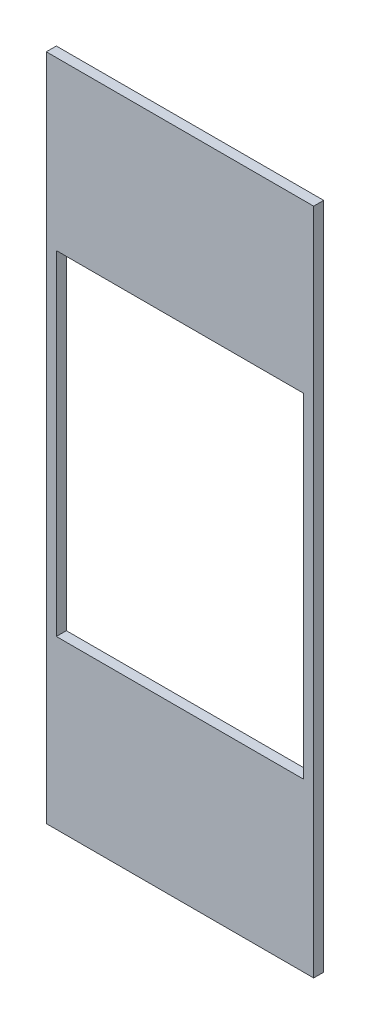
ISO-10303-21;
HEADER;
FILE_DESCRIPTION(('STEP AP214'),'2;1');
FILE_NAME('part.step','',(''),(''),'','','');
FILE_SCHEMA(('AUTOMOTIVE_DESIGN { 1 0 10303 214 1 1 1 1 }'));
ENDSEC;
DATA;
#1=APPLICATION_CONTEXT('core data for automotive mechanical design processes');
#2=APPLICATION_PROTOCOL_DEFINITION('international standard','automotive_design',2000,#1);
#3=PRODUCT_CONTEXT('',#1,'mechanical');
#4=PRODUCT('Part','Part','',(#3));
#5=PRODUCT_RELATED_PRODUCT_CATEGORY('part','',(#4));
#6=PRODUCT_DEFINITION_FORMATION('','',#4);
#7=PRODUCT_DEFINITION_CONTEXT('part definition',#1,'design');
#8=PRODUCT_DEFINITION('design','',#6,#7);
#9=PRODUCT_DEFINITION_SHAPE('','',#8);
#10=(LENGTH_UNIT() NAMED_UNIT(*) SI_UNIT(.MILLI.,.METRE.));
#11=(NAMED_UNIT(*) PLANE_ANGLE_UNIT() SI_UNIT($,.RADIAN.));
#12=(NAMED_UNIT(*) SI_UNIT($,.STERADIAN.) SOLID_ANGLE_UNIT());
#13=UNCERTAINTY_MEASURE_WITH_UNIT(LENGTH_MEASURE(1.E-05),#10,'distance_accuracy_value','');
#14=(GEOMETRIC_REPRESENTATION_CONTEXT(3) GLOBAL_UNCERTAINTY_ASSIGNED_CONTEXT((#13)) GLOBAL_UNIT_ASSIGNED_CONTEXT((#10,
#11,#12)) REPRESENTATION_CONTEXT('',''));
#15=CARTESIAN_POINT('',(0.,0.,0.));
#16=DIRECTION('',(0.,0.,1.));
#17=DIRECTION('',(1.,0.,0.));
#18=AXIS2_PLACEMENT_3D('',#15,#16,#17);
#19=CARTESIAN_POINT('',(-20.,50.,1.5));
#20=DIRECTION('',(1.,0.,0.));
#21=DIRECTION('',(0.,1.,0.));
#22=AXIS2_PLACEMENT_3D('',#19,#20,#21);
#23=PLANE('',#22);
#24=DIRECTION('',(0.,-1.,0.));
#25=VECTOR('',#24,1.);
#26=CARTESIAN_POINT('',(-20.,50.,0.));
#27=LINE('',#26,#25);
#28=CARTESIAN_POINT('',(-20.,50.,0.));
#29=VERTEX_POINT('',#28);
#30=CARTESIAN_POINT('',(-20.,-50.,0.));
#31=VERTEX_POINT('',#30);
#32=EDGE_CURVE('E139',#29,#31,#27,.T.);
#33=ORIENTED_EDGE('',*,*,#32,.T.);
#34=DIRECTION('',(0.,0.,-1.));
#35=VECTOR('',#34,1.);
#36=CARTESIAN_POINT('',(-20.,-50.,1.5));
#37=LINE('',#36,#35);
#38=CARTESIAN_POINT('',(-20.,-50.,1.5));
#39=VERTEX_POINT('',#38);
#40=EDGE_CURVE('E11',#39,#31,#37,.T.);
#41=ORIENTED_EDGE('',*,*,#40,.F.);
#42=DIRECTION('',(0.,-1.,0.));
#43=VECTOR('',#42,1.);
#44=CARTESIAN_POINT('',(-20.,50.,1.5));
#45=LINE('',#44,#43);
#46=CARTESIAN_POINT('',(-20.,50.,1.5));
#47=VERTEX_POINT('',#46);
#48=EDGE_CURVE('E143',#47,#39,#45,.T.);
#49=ORIENTED_EDGE('',*,*,#48,.F.);
#50=DIRECTION('',(0.,0.,-1.));
#51=VECTOR('',#50,1.);
#52=CARTESIAN_POINT('',(-20.,50.,1.5));
#53=LINE('',#52,#51);
#54=EDGE_CURVE('E153',#47,#29,#53,.T.);
#55=ORIENTED_EDGE('',*,*,#54,.T.);
#56=EDGE_LOOP('',(#33,#41,#49,#55));
#57=FACE_BOUND('',#56,.T.);
#58=ADVANCED_FACE('F42',(#57),#23,.F.);
#59=CARTESIAN_POINT('',(-20.,-50.,1.5));
#60=DIRECTION('',(0.,1.,0.));
#61=DIRECTION('',(0.,0.,1.));
#62=AXIS2_PLACEMENT_3D('',#59,#60,#61);
#63=PLANE('',#62);
#64=DIRECTION('',(1.,0.,0.));
#65=VECTOR('',#64,1.);
#66=CARTESIAN_POINT('',(-20.,-50.,0.));
#67=LINE('',#66,#65);
#68=CARTESIAN_POINT('',(20.,-50.,0.));
#69=VERTEX_POINT('',#68);
#70=EDGE_CURVE('E156',#31,#69,#67,.T.);
#71=ORIENTED_EDGE('',*,*,#70,.T.);
#72=DIRECTION('',(0.,0.,-1.));
#73=VECTOR('',#72,1.);
#74=CARTESIAN_POINT('',(20.,-50.,1.5));
#75=LINE('',#74,#73);
#76=CARTESIAN_POINT('',(20.,-50.,1.5));
#77=VERTEX_POINT('',#76);
#78=EDGE_CURVE('E49',#77,#69,#75,.T.);
#79=ORIENTED_EDGE('',*,*,#78,.F.);
#80=DIRECTION('',(1.,0.,0.));
#81=VECTOR('',#80,1.);
#82=CARTESIAN_POINT('',(-20.,-50.,1.5));
#83=LINE('',#82,#81);
#84=EDGE_CURVE('E146',#39,#77,#83,.T.);
#85=ORIENTED_EDGE('',*,*,#84,.F.);
#86=ORIENTED_EDGE('',*,*,#40,.T.);
#87=EDGE_LOOP('',(#71,#79,#85,#86));
#88=FACE_BOUND('',#87,.T.);
#89=ADVANCED_FACE('F184',(#88),#63,.F.);
#90=CARTESIAN_POINT('',(20.,-50.,1.5));
#91=DIRECTION('',(-1.,0.,0.));
#92=DIRECTION('',(0.,0.,1.));
#93=AXIS2_PLACEMENT_3D('',#90,#91,#92);
#94=PLANE('',#93);
#95=DIRECTION('',(0.,1.,0.));
#96=VECTOR('',#95,1.);
#97=CARTESIAN_POINT('',(20.,-50.,0.));
#98=LINE('',#97,#96);
#99=CARTESIAN_POINT('',(20.,50.,0.));
#100=VERTEX_POINT('',#99);
#101=EDGE_CURVE('E158',#69,#100,#98,.T.);
#102=ORIENTED_EDGE('',*,*,#101,.T.);
#103=DIRECTION('',(0.,0.,-1.));
#104=VECTOR('',#103,1.);
#105=CARTESIAN_POINT('',(20.,50.,1.5));
#106=LINE('',#105,#104);
#107=CARTESIAN_POINT('',(20.,50.,1.5));
#108=VERTEX_POINT('',#107);
#109=EDGE_CURVE('E163',#108,#100,#106,.T.);
#110=ORIENTED_EDGE('',*,*,#109,.F.);
#111=DIRECTION('',(0.,1.,0.));
#112=VECTOR('',#111,1.);
#113=CARTESIAN_POINT('',(20.,-50.,1.5));
#114=LINE('',#113,#112);
#115=EDGE_CURVE('E149',#77,#108,#114,.T.);
#116=ORIENTED_EDGE('',*,*,#115,.F.);
#117=ORIENTED_EDGE('',*,*,#78,.T.);
#118=EDGE_LOOP('',(#102,#110,#116,#117));
#119=FACE_BOUND('',#118,.T.);
#120=ADVANCED_FACE('F170',(#119),#94,.F.);
#121=CARTESIAN_POINT('',(-20.,50.,1.5));
#122=DIRECTION('',(0.,-1.,0.));
#123=DIRECTION('',(0.,0.,-1.));
#124=AXIS2_PLACEMENT_3D('',#121,#122,#123);
#125=PLANE('',#124);
#126=DIRECTION('',(-1.,0.,0.));
#127=VECTOR('',#126,1.);
#128=CARTESIAN_POINT('',(-20.,50.,0.));
#129=LINE('',#128,#127);
#130=EDGE_CURVE('E147',#100,#29,#129,.T.);
#131=ORIENTED_EDGE('',*,*,#130,.T.);
#132=ORIENTED_EDGE('',*,*,#54,.F.);
#133=DIRECTION('',(-1.,0.,0.));
#134=VECTOR('',#133,1.);
#135=CARTESIAN_POINT('',(-20.,50.,1.5));
#136=LINE('',#135,#134);
#137=EDGE_CURVE('E151',#108,#47,#136,.T.);
#138=ORIENTED_EDGE('',*,*,#137,.F.);
#139=ORIENTED_EDGE('',*,*,#109,.T.);
#140=EDGE_LOOP('',(#131,#132,#138,#139));
#141=FACE_BOUND('',#140,.T.);
#142=ADVANCED_FACE('F177',(#141),#125,.F.);
#143=CARTESIAN_POINT('',(0.,0.,1.5));
#144=DIRECTION('',(0.,0.,1.));
#145=DIRECTION('',(1.,0.,0.));
#146=AXIS2_PLACEMENT_3D('',#143,#144,#145);
#147=PLANE('',#146);
#148=DIRECTION('',(1.,0.,0.));
#149=VECTOR('',#148,1.);
#150=CARTESIAN_POINT('',(-18.5,-25.,1.5));
#151=LINE('',#150,#149);
#152=CARTESIAN_POINT('',(-18.5,-25.,1.5));
#153=VERTEX_POINT('',#152);
#154=CARTESIAN_POINT('',(18.5,-25.,1.5));
#155=VERTEX_POINT('',#154);
#156=EDGE_CURVE('E56',#153,#155,#151,.T.);
#157=ORIENTED_EDGE('',*,*,#156,.F.);
#158=DIRECTION('',(0.,-1.,0.));
#159=VECTOR('',#158,1.);
#160=CARTESIAN_POINT('',(-18.5,25.,1.5));
#161=LINE('',#160,#159);
#162=CARTESIAN_POINT('',(-18.5,25.,1.5));
#163=VERTEX_POINT('',#162);
#164=EDGE_CURVE('E124',#163,#153,#161,.T.);
#165=ORIENTED_EDGE('',*,*,#164,.F.);
#166=DIRECTION('',(-1.,0.,0.));
#167=VECTOR('',#166,1.);
#168=CARTESIAN_POINT('',(-18.5,25.,1.5));
#169=LINE('',#168,#167);
#170=CARTESIAN_POINT('',(18.5,25.,1.5));
#171=VERTEX_POINT('',#170);
#172=EDGE_CURVE('E127',#171,#163,#169,.T.);
#173=ORIENTED_EDGE('',*,*,#172,.F.);
#174=DIRECTION('',(0.,1.,0.));
#175=VECTOR('',#174,1.);
#176=CARTESIAN_POINT('',(18.5,25.,1.5));
#177=LINE('',#176,#175);
#178=EDGE_CURVE('E133',#155,#171,#177,.T.);
#179=ORIENTED_EDGE('',*,*,#178,.F.);
#180=EDGE_LOOP('',(#157,#165,#173,#179));
#181=FACE_BOUND('',#180,.T.);
#182=ORIENTED_EDGE('',*,*,#48,.T.);
#183=ORIENTED_EDGE('',*,*,#84,.T.);
#184=ORIENTED_EDGE('',*,*,#115,.T.);
#185=ORIENTED_EDGE('',*,*,#137,.T.);
#186=EDGE_LOOP('',(#182,#183,#184,#185));
#187=FACE_BOUND('',#186,.T.);
#188=ADVANCED_FACE('F183',(#181,#187),#147,.T.);
#189=CARTESIAN_POINT('',(0.,0.,0.));
#190=DIRECTION('',(0.,0.,1.));
#191=DIRECTION('',(1.,0.,0.));
#192=AXIS2_PLACEMENT_3D('',#189,#190,#191);
#193=PLANE('',#192);
#194=DIRECTION('',(0.,-1.,0.));
#195=VECTOR('',#194,1.);
#196=CARTESIAN_POINT('',(-18.5,25.,0.));
#197=LINE('',#196,#195);
#198=CARTESIAN_POINT('',(-18.5,25.,0.));
#199=VERTEX_POINT('',#198);
#200=CARTESIAN_POINT('',(-18.5,-25.,0.));
#201=VERTEX_POINT('',#200);
#202=EDGE_CURVE('E114',#199,#201,#197,.T.);
#203=ORIENTED_EDGE('',*,*,#202,.T.);
#204=DIRECTION('',(1.,0.,0.));
#205=VECTOR('',#204,1.);
#206=CARTESIAN_POINT('',(-18.5,-25.,0.));
#207=LINE('',#206,#205);
#208=CARTESIAN_POINT('',(18.5,-25.,0.));
#209=VERTEX_POINT('',#208);
#210=EDGE_CURVE('E108',#201,#209,#207,.T.);
#211=ORIENTED_EDGE('',*,*,#210,.T.);
#212=DIRECTION('',(0.,1.,0.));
#213=VECTOR('',#212,1.);
#214=CARTESIAN_POINT('',(18.5,25.,0.));
#215=LINE('',#214,#213);
#216=CARTESIAN_POINT('',(18.5,25.,0.));
#217=VERTEX_POINT('',#216);
#218=EDGE_CURVE('E117',#209,#217,#215,.T.);
#219=ORIENTED_EDGE('',*,*,#218,.T.);
#220=DIRECTION('',(-1.,0.,0.));
#221=VECTOR('',#220,1.);
#222=CARTESIAN_POINT('',(-18.5,25.,0.));
#223=LINE('',#222,#221);
#224=EDGE_CURVE('E64',#217,#199,#223,.T.);
#225=ORIENTED_EDGE('',*,*,#224,.T.);
#226=EDGE_LOOP('',(#203,#211,#219,#225));
#227=FACE_BOUND('',#226,.T.);
#228=ORIENTED_EDGE('',*,*,#32,.F.);
#229=ORIENTED_EDGE('',*,*,#130,.F.);
#230=ORIENTED_EDGE('',*,*,#101,.F.);
#231=ORIENTED_EDGE('',*,*,#70,.F.);
#232=EDGE_LOOP('',(#228,#229,#230,#231));
#233=FACE_BOUND('',#232,.T.);
#234=ADVANCED_FACE('F121',(#227,#233),#193,.F.);
#235=CARTESIAN_POINT('',(-18.5,-25.,0.));
#236=DIRECTION('',(0.,-1.,0.));
#237=DIRECTION('',(0.,0.,-1.));
#238=AXIS2_PLACEMENT_3D('',#235,#236,#237);
#239=PLANE('',#238);
#240=ORIENTED_EDGE('',*,*,#156,.T.);
#241=DIRECTION('',(0.,0.,1.));
#242=VECTOR('',#241,1.);
#243=CARTESIAN_POINT('',(18.5,-25.,0.));
#244=LINE('',#243,#242);
#245=EDGE_CURVE('E104',#209,#155,#244,.T.);
#246=ORIENTED_EDGE('',*,*,#245,.F.);
#247=ORIENTED_EDGE('',*,*,#210,.F.);
#248=DIRECTION('',(0.,0.,1.));
#249=VECTOR('',#248,1.);
#250=CARTESIAN_POINT('',(-18.5,-25.,0.));
#251=LINE('',#250,#249);
#252=EDGE_CURVE('E137',#201,#153,#251,.T.);
#253=ORIENTED_EDGE('',*,*,#252,.T.);
#254=EDGE_LOOP('',(#240,#246,#247,#253));
#255=FACE_BOUND('',#254,.T.);
#256=ADVANCED_FACE('F106',(#255),#239,.F.);
#257=CARTESIAN_POINT('',(-18.5,25.,0.));
#258=DIRECTION('',(-1.,0.,0.));
#259=DIRECTION('',(0.,0.,1.));
#260=AXIS2_PLACEMENT_3D('',#257,#258,#259);
#261=PLANE('',#260);
#262=ORIENTED_EDGE('',*,*,#164,.T.);
#263=ORIENTED_EDGE('',*,*,#252,.F.);
#264=ORIENTED_EDGE('',*,*,#202,.F.);
#265=DIRECTION('',(0.,0.,1.));
#266=VECTOR('',#265,1.);
#267=CARTESIAN_POINT('',(-18.5,25.,0.));
#268=LINE('',#267,#266);
#269=EDGE_CURVE('E140',#199,#163,#268,.T.);
#270=ORIENTED_EDGE('',*,*,#269,.T.);
#271=EDGE_LOOP('',(#262,#263,#264,#270));
#272=FACE_BOUND('',#271,.T.);
#273=ADVANCED_FACE('F201',(#272),#261,.F.);
#274=CARTESIAN_POINT('',(-18.5,25.,0.));
#275=DIRECTION('',(0.,1.,0.));
#276=DIRECTION('',(0.,0.,1.));
#277=AXIS2_PLACEMENT_3D('',#274,#275,#276);
#278=PLANE('',#277);
#279=ORIENTED_EDGE('',*,*,#172,.T.);
#280=ORIENTED_EDGE('',*,*,#269,.F.);
#281=ORIENTED_EDGE('',*,*,#224,.F.);
#282=DIRECTION('',(0.,0.,1.));
#283=VECTOR('',#282,1.);
#284=CARTESIAN_POINT('',(18.5,25.,0.));
#285=LINE('',#284,#283);
#286=EDGE_CURVE('E113',#217,#171,#285,.T.);
#287=ORIENTED_EDGE('',*,*,#286,.T.);
#288=EDGE_LOOP('',(#279,#280,#281,#287));
#289=FACE_BOUND('',#288,.T.);
#290=ADVANCED_FACE('F204',(#289),#278,.F.);
#291=CARTESIAN_POINT('',(18.5,25.,0.));
#292=DIRECTION('',(1.,0.,0.));
#293=DIRECTION('',(0.,1.,0.));
#294=AXIS2_PLACEMENT_3D('',#291,#292,#293);
#295=PLANE('',#294);
#296=ORIENTED_EDGE('',*,*,#178,.T.);
#297=ORIENTED_EDGE('',*,*,#286,.F.);
#298=ORIENTED_EDGE('',*,*,#218,.F.);
#299=ORIENTED_EDGE('',*,*,#245,.T.);
#300=EDGE_LOOP('',(#296,#297,#298,#299));
#301=FACE_BOUND('',#300,.T.);
#302=ADVANCED_FACE('F118',(#301),#295,.F.);
#303=CLOSED_SHELL('',(#58,#89,#120,#142,#188,#234,#256,#273,#290,#302));
#304=MANIFOLD_SOLID_BREP('B2',#303);
#305=ADVANCED_BREP_SHAPE_REPRESENTATION('',(#18,#304),#14);
#306=SHAPE_DEFINITION_REPRESENTATION(#9,#305);
ENDSEC;
END-ISO-10303-21;
